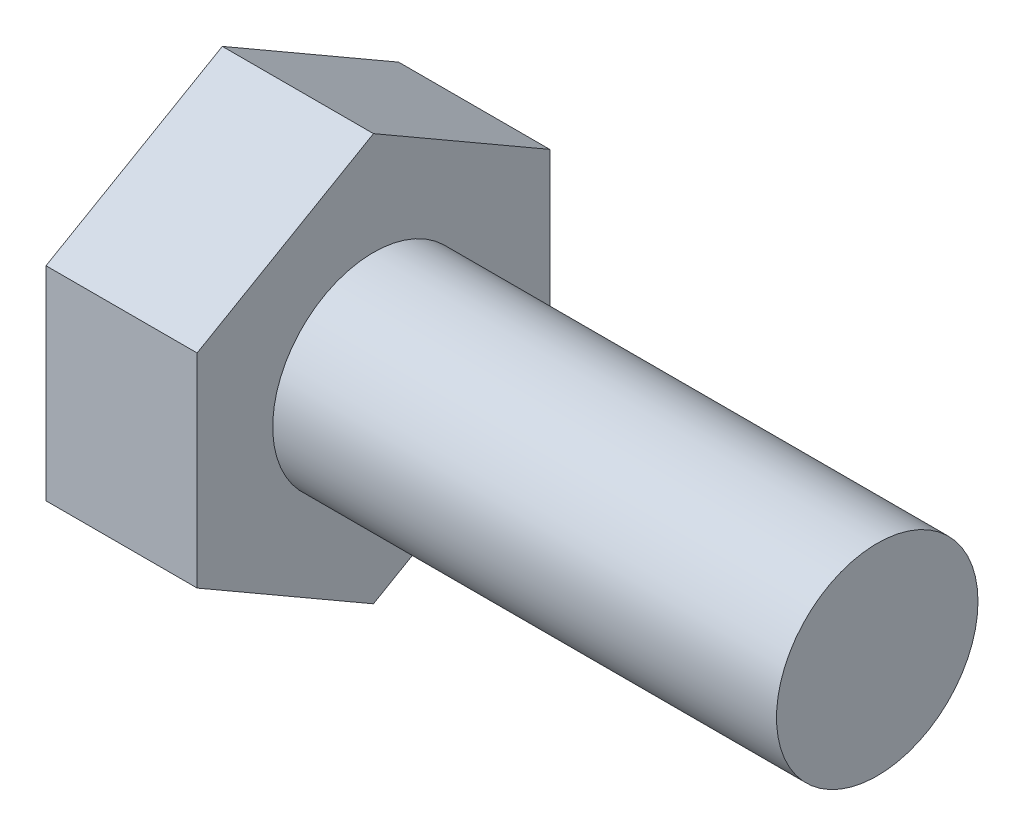
ISO-10303-21;
HEADER;
FILE_DESCRIPTION(('STEP AP214'),'2;1');
FILE_NAME('part.step','',(''),(''),'','','');
FILE_SCHEMA(('AUTOMOTIVE_DESIGN { 1 0 10303 214 1 1 1 1 }'));
ENDSEC;
DATA;
#1=APPLICATION_CONTEXT('core data for automotive mechanical design processes');
#2=APPLICATION_PROTOCOL_DEFINITION('international standard','automotive_design',2000,#1);
#3=PRODUCT_CONTEXT('',#1,'mechanical');
#4=PRODUCT('Part','Part','',(#3));
#5=PRODUCT_RELATED_PRODUCT_CATEGORY('part','',(#4));
#6=PRODUCT_DEFINITION_FORMATION('','',#4);
#7=PRODUCT_DEFINITION_CONTEXT('part definition',#1,'design');
#8=PRODUCT_DEFINITION('design','',#6,#7);
#9=PRODUCT_DEFINITION_SHAPE('','',#8);
#10=(LENGTH_UNIT() NAMED_UNIT(*) SI_UNIT(.MILLI.,.METRE.));
#11=(NAMED_UNIT(*) PLANE_ANGLE_UNIT() SI_UNIT($,.RADIAN.));
#12=(NAMED_UNIT(*) SI_UNIT($,.STERADIAN.) SOLID_ANGLE_UNIT());
#13=UNCERTAINTY_MEASURE_WITH_UNIT(LENGTH_MEASURE(1.E-05),#10,'distance_accuracy_value','');
#14=(GEOMETRIC_REPRESENTATION_CONTEXT(3) GLOBAL_UNCERTAINTY_ASSIGNED_CONTEXT((#13)) GLOBAL_UNIT_ASSIGNED_CONTEXT((#10,
#11,#12)) REPRESENTATION_CONTEXT('',''));
#15=CARTESIAN_POINT('',(0.,0.,0.));
#16=DIRECTION('',(0.,0.,1.));
#17=DIRECTION('',(1.,0.,0.));
#18=AXIS2_PLACEMENT_3D('',#15,#16,#17);
#19=CARTESIAN_POINT('',(10.,0.,0.));
#20=DIRECTION('',(-1.,0.,0.));
#21=DIRECTION('',(0.,0.,1.));
#22=AXIS2_PLACEMENT_3D('',#19,#20,#21);
#23=CYLINDRICAL_SURFACE('',#22,2.);
#24=CARTESIAN_POINT('',(10.,0.,0.));
#25=DIRECTION('',(1.,0.,0.));
#26=DIRECTION('',(0.,0.,-1.));
#27=AXIS2_PLACEMENT_3D('',#24,#25,#26);
#28=CIRCLE('',#27,2.);
#29=CARTESIAN_POINT('',(10.,0.,-2.));
#30=VERTEX_POINT('',#29);
#31=EDGE_CURVE('E11',#30,#30,#28,.T.);
#32=ORIENTED_EDGE('',*,*,#31,.F.);
#33=EDGE_LOOP('',(#32));
#34=FACE_BOUND('',#33,.T.);
#35=CARTESIAN_POINT('',(0.,0.,0.));
#36=DIRECTION('',(1.,0.,0.));
#37=DIRECTION('',(0.,0.,-1.));
#38=AXIS2_PLACEMENT_3D('',#35,#36,#37);
#39=CIRCLE('',#38,2.);
#40=CARTESIAN_POINT('',(0.,0.,-2.));
#41=VERTEX_POINT('',#40);
#42=EDGE_CURVE('E37',#41,#41,#39,.T.);
#43=ORIENTED_EDGE('',*,*,#42,.T.);
#44=EDGE_LOOP('',(#43));
#45=FACE_BOUND('',#44,.T.);
#46=ADVANCED_FACE('F34',(#34,#45),#23,.T.);
#47=CARTESIAN_POINT('',(10.,0.,0.));
#48=DIRECTION('',(1.,0.,0.));
#49=DIRECTION('',(0.,0.,-1.));
#50=AXIS2_PLACEMENT_3D('',#47,#48,#49);
#51=PLANE('',#50);
#52=ORIENTED_EDGE('',*,*,#31,.T.);
#53=EDGE_LOOP('',(#52));
#54=FACE_BOUND('',#53,.T.);
#55=ADVANCED_FACE('F161',(#54),#51,.T.);
#56=CARTESIAN_POINT('',(-3.,-4.04145188432738,0.));
#57=DIRECTION('',(0.,0.866025403784438,-0.5));
#58=DIRECTION('',(0.,0.5,0.866025403784438));
#59=AXIS2_PLACEMENT_3D('',#56,#57,#58);
#60=PLANE('',#59);
#61=DIRECTION('',(0.,0.5,0.866025403784438));
#62=VECTOR('',#61,1.);
#63=CARTESIAN_POINT('',(0.,-4.04145188432738,0.));
#64=LINE('',#63,#62);
#65=CARTESIAN_POINT('',(0.,-4.04145188432738,0.));
#66=VERTEX_POINT('',#65);
#67=CARTESIAN_POINT('',(0.,-2.02072594216369,3.5));
#68=VERTEX_POINT('',#67);
#69=EDGE_CURVE('E119',#66,#68,#64,.T.);
#70=ORIENTED_EDGE('',*,*,#69,.T.);
#71=DIRECTION('',(1.,0.,0.));
#72=VECTOR('',#71,1.);
#73=CARTESIAN_POINT('',(-3.,-2.02072594216369,3.5));
#74=LINE('',#73,#72);
#75=CARTESIAN_POINT('',(-3.,-2.02072594216369,3.5));
#76=VERTEX_POINT('',#75);
#77=EDGE_CURVE('E136',#76,#68,#74,.T.);
#78=ORIENTED_EDGE('',*,*,#77,.F.);
#79=DIRECTION('',(0.,0.5,0.866025403784438));
#80=VECTOR('',#79,1.);
#81=CARTESIAN_POINT('',(-3.,-4.04145188432738,0.));
#82=LINE('',#81,#80);
#83=CARTESIAN_POINT('',(-3.,-4.04145188432738,0.));
#84=VERTEX_POINT('',#83);
#85=EDGE_CURVE('E129',#84,#76,#82,.T.);
#86=ORIENTED_EDGE('',*,*,#85,.F.);
#87=DIRECTION('',(1.,0.,0.));
#88=VECTOR('',#87,1.);
#89=CARTESIAN_POINT('',(-3.,-4.04145188432738,0.));
#90=LINE('',#89,#88);
#91=EDGE_CURVE('E115',#84,#66,#90,.T.);
#92=ORIENTED_EDGE('',*,*,#91,.T.);
#93=EDGE_LOOP('',(#70,#78,#86,#92));
#94=FACE_BOUND('',#93,.T.);
#95=ADVANCED_FACE('F149',(#94),#60,.F.);
#96=CARTESIAN_POINT('',(-3.,-2.02072594216369,3.5));
#97=DIRECTION('',(0.,0.,-1.));
#98=DIRECTION('',(-1.,0.,0.));
#99=AXIS2_PLACEMENT_3D('',#96,#97,#98);
#100=PLANE('',#99);
#101=DIRECTION('',(0.,1.,0.));
#102=VECTOR('',#101,1.);
#103=CARTESIAN_POINT('',(0.,-2.02072594216369,3.5));
#104=LINE('',#103,#102);
#105=CARTESIAN_POINT('',(0.,2.02072594216369,3.5));
#106=VERTEX_POINT('',#105);
#107=EDGE_CURVE('E122',#68,#106,#104,.T.);
#108=ORIENTED_EDGE('',*,*,#107,.T.);
#109=DIRECTION('',(1.,0.,0.));
#110=VECTOR('',#109,1.);
#111=CARTESIAN_POINT('',(-3.,2.02072594216369,3.5));
#112=LINE('',#111,#110);
#113=CARTESIAN_POINT('',(-3.,2.02072594216369,3.5));
#114=VERTEX_POINT('',#113);
#115=EDGE_CURVE('E133',#114,#106,#112,.T.);
#116=ORIENTED_EDGE('',*,*,#115,.F.);
#117=DIRECTION('',(0.,1.,0.));
#118=VECTOR('',#117,1.);
#119=CARTESIAN_POINT('',(-3.,-2.02072594216369,3.5));
#120=LINE('',#119,#118);
#121=EDGE_CURVE('E88',#76,#114,#120,.T.);
#122=ORIENTED_EDGE('',*,*,#121,.F.);
#123=ORIENTED_EDGE('',*,*,#77,.T.);
#124=EDGE_LOOP('',(#108,#116,#122,#123));
#125=FACE_BOUND('',#124,.T.);
#126=ADVANCED_FACE('F171',(#125),#100,.F.);
#127=CARTESIAN_POINT('',(-3.,2.02072594216369,3.5));
#128=DIRECTION('',(0.,-0.866025403784439,-0.5));
#129=DIRECTION('',(0.,0.5,-0.866025403784439));
#130=AXIS2_PLACEMENT_3D('',#127,#128,#129);
#131=PLANE('',#130);
#132=DIRECTION('',(0.,0.5,-0.866025403784438));
#133=VECTOR('',#132,1.);
#134=CARTESIAN_POINT('',(0.,2.02072594216369,3.5));
#135=LINE('',#134,#133);
#136=CARTESIAN_POINT('',(0.,4.04145188432738,0.));
#137=VERTEX_POINT('',#136);
#138=EDGE_CURVE('E124',#106,#137,#135,.T.);
#139=ORIENTED_EDGE('',*,*,#138,.T.);
#140=DIRECTION('',(1.,0.,0.));
#141=VECTOR('',#140,1.);
#142=CARTESIAN_POINT('',(-3.,4.04145188432738,0.));
#143=LINE('',#142,#141);
#144=CARTESIAN_POINT('',(-3.,4.04145188432738,0.));
#145=VERTEX_POINT('',#144);
#146=EDGE_CURVE('E110',#145,#137,#143,.T.);
#147=ORIENTED_EDGE('',*,*,#146,.F.);
#148=DIRECTION('',(0.,0.5,-0.866025403784438));
#149=VECTOR('',#148,1.);
#150=CARTESIAN_POINT('',(-3.,2.02072594216369,3.5));
#151=LINE('',#150,#149);
#152=EDGE_CURVE('E101',#114,#145,#151,.T.);
#153=ORIENTED_EDGE('',*,*,#152,.F.);
#154=ORIENTED_EDGE('',*,*,#115,.T.);
#155=EDGE_LOOP('',(#139,#147,#153,#154));
#156=FACE_BOUND('',#155,.T.);
#157=ADVANCED_FACE('F176',(#156),#131,.F.);
#158=CARTESIAN_POINT('',(-3.,4.04145188432738,0.));
#159=DIRECTION('',(0.,-0.866025403784438,0.5));
#160=DIRECTION('',(0.,-0.5,-0.866025403784439));
#161=AXIS2_PLACEMENT_3D('',#158,#159,#160);
#162=PLANE('',#161);
#163=DIRECTION('',(0.,-0.5,-0.866025403784439));
#164=VECTOR('',#163,1.);
#165=CARTESIAN_POINT('',(0.,4.04145188432738,0.));
#166=LINE('',#165,#164);
#167=CARTESIAN_POINT('',(0.,2.02072594216369,-3.5));
#168=VERTEX_POINT('',#167);
#169=EDGE_CURVE('E109',#137,#168,#166,.T.);
#170=ORIENTED_EDGE('',*,*,#169,.T.);
#171=DIRECTION('',(1.,0.,0.));
#172=VECTOR('',#171,1.);
#173=CARTESIAN_POINT('',(-3.,2.02072594216369,-3.5));
#174=LINE('',#173,#172);
#175=CARTESIAN_POINT('',(-3.,2.02072594216369,-3.5));
#176=VERTEX_POINT('',#175);
#177=EDGE_CURVE('E106',#176,#168,#174,.T.);
#178=ORIENTED_EDGE('',*,*,#177,.F.);
#179=DIRECTION('',(0.,-0.5,-0.866025403784439));
#180=VECTOR('',#179,1.);
#181=CARTESIAN_POINT('',(-3.,4.04145188432738,0.));
#182=LINE('',#181,#180);
#183=EDGE_CURVE('E95',#145,#176,#182,.T.);
#184=ORIENTED_EDGE('',*,*,#183,.F.);
#185=ORIENTED_EDGE('',*,*,#146,.T.);
#186=EDGE_LOOP('',(#170,#178,#184,#185));
#187=FACE_BOUND('',#186,.T.);
#188=ADVANCED_FACE('F107',(#187),#162,.F.);
#189=CARTESIAN_POINT('',(-3.,2.02072594216369,-3.5));
#190=DIRECTION('',(0.,0.,1.));
#191=DIRECTION('',(0.,-1.,0.));
#192=AXIS2_PLACEMENT_3D('',#189,#190,#191);
#193=PLANE('',#192);
#194=DIRECTION('',(0.,-1.,0.));
#195=VECTOR('',#194,1.);
#196=CARTESIAN_POINT('',(0.,2.02072594216369,-3.5));
#197=LINE('',#196,#195);
#198=CARTESIAN_POINT('',(0.,-2.02072594216369,-3.5));
#199=VERTEX_POINT('',#198);
#200=EDGE_CURVE('E73',#168,#199,#197,.T.);
#201=ORIENTED_EDGE('',*,*,#200,.T.);
#202=DIRECTION('',(1.,0.,0.));
#203=VECTOR('',#202,1.);
#204=CARTESIAN_POINT('',(-3.,-2.02072594216369,-3.5));
#205=LINE('',#204,#203);
#206=CARTESIAN_POINT('',(-3.,-2.02072594216369,-3.5));
#207=VERTEX_POINT('',#206);
#208=EDGE_CURVE('E111',#207,#199,#205,.T.);
#209=ORIENTED_EDGE('',*,*,#208,.F.);
#210=DIRECTION('',(0.,-1.,0.));
#211=VECTOR('',#210,1.);
#212=CARTESIAN_POINT('',(-3.,2.02072594216369,-3.5));
#213=LINE('',#212,#211);
#214=EDGE_CURVE('E99',#176,#207,#213,.T.);
#215=ORIENTED_EDGE('',*,*,#214,.F.);
#216=ORIENTED_EDGE('',*,*,#177,.T.);
#217=EDGE_LOOP('',(#201,#209,#215,#216));
#218=FACE_BOUND('',#217,.T.);
#219=ADVANCED_FACE('F113',(#218),#193,.F.);
#220=CARTESIAN_POINT('',(-3.,-2.02072594216369,-3.5));
#221=DIRECTION('',(0.,0.866025403784439,0.5));
#222=DIRECTION('',(0.,-0.5,0.866025403784439));
#223=AXIS2_PLACEMENT_3D('',#220,#221,#222);
#224=PLANE('',#223);
#225=DIRECTION('',(0.,-0.5,0.866025403784439));
#226=VECTOR('',#225,1.);
#227=CARTESIAN_POINT('',(0.,-2.02072594216369,-3.5));
#228=LINE('',#227,#226);
#229=EDGE_CURVE('E79',#199,#66,#228,.T.);
#230=ORIENTED_EDGE('',*,*,#229,.T.);
#231=ORIENTED_EDGE('',*,*,#91,.F.);
#232=DIRECTION('',(0.,-0.5,0.866025403784439));
#233=VECTOR('',#232,1.);
#234=CARTESIAN_POINT('',(-3.,-2.02072594216369,-3.5));
#235=LINE('',#234,#233);
#236=EDGE_CURVE('E50',#207,#84,#235,.T.);
#237=ORIENTED_EDGE('',*,*,#236,.F.);
#238=ORIENTED_EDGE('',*,*,#208,.T.);
#239=EDGE_LOOP('',(#230,#231,#237,#238));
#240=FACE_BOUND('',#239,.T.);
#241=ADVANCED_FACE('F151',(#240),#224,.F.);
#242=CARTESIAN_POINT('',(-3.,0.,0.));
#243=DIRECTION('',(-1.,0.,0.));
#244=DIRECTION('',(0.,0.,1.));
#245=AXIS2_PLACEMENT_3D('',#242,#243,#244);
#246=PLANE('',#245);
#247=ORIENTED_EDGE('',*,*,#85,.T.);
#248=ORIENTED_EDGE('',*,*,#121,.T.);
#249=ORIENTED_EDGE('',*,*,#152,.T.);
#250=ORIENTED_EDGE('',*,*,#183,.T.);
#251=ORIENTED_EDGE('',*,*,#214,.T.);
#252=ORIENTED_EDGE('',*,*,#236,.T.);
#253=EDGE_LOOP('',(#247,#248,#249,#250,#251,#252));
#254=FACE_BOUND('',#253,.T.);
#255=ADVANCED_FACE('F97',(#254),#246,.T.);
#256=CARTESIAN_POINT('',(0.,0.,0.));
#257=DIRECTION('',(-1.,0.,0.));
#258=DIRECTION('',(0.,0.,1.));
#259=AXIS2_PLACEMENT_3D('',#256,#257,#258);
#260=PLANE('',#259);
#261=ORIENTED_EDGE('',*,*,#42,.F.);
#262=EDGE_LOOP('',(#261));
#263=FACE_BOUND('',#262,.T.);
#264=ORIENTED_EDGE('',*,*,#69,.F.);
#265=ORIENTED_EDGE('',*,*,#229,.F.);
#266=ORIENTED_EDGE('',*,*,#200,.F.);
#267=ORIENTED_EDGE('',*,*,#169,.F.);
#268=ORIENTED_EDGE('',*,*,#138,.F.);
#269=ORIENTED_EDGE('',*,*,#107,.F.);
#270=EDGE_LOOP('',(#264,#265,#266,#267,#268,#269));
#271=FACE_BOUND('',#270,.T.);
#272=ADVANCED_FACE('F142',(#263,#271),#260,.F.);
#273=CLOSED_SHELL('',(#46,#55,#95,#126,#157,#188,#219,#241,#255,#272));
#274=MANIFOLD_SOLID_BREP('B2',#273);
#275=ADVANCED_BREP_SHAPE_REPRESENTATION('',(#18,#274),#14);
#276=SHAPE_DEFINITION_REPRESENTATION(#9,#275);
ENDSEC;
END-ISO-10303-21;
